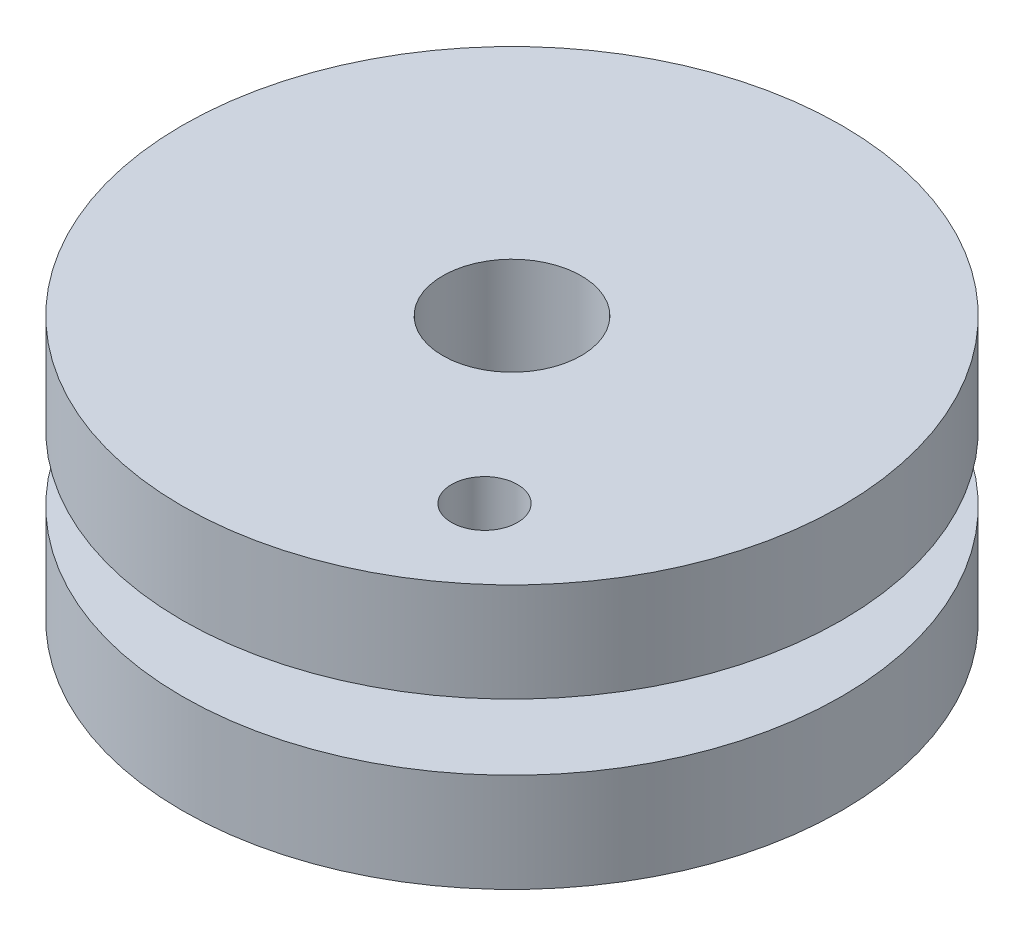
ISO-10303-21;
HEADER;
FILE_DESCRIPTION(('STEP AP214'),'2;1');
FILE_NAME('part.step','',(''),(''),'','','');
FILE_SCHEMA(('AUTOMOTIVE_DESIGN { 1 0 10303 214 1 1 1 1 }'));
ENDSEC;
DATA;
#1=APPLICATION_CONTEXT('core data for automotive mechanical design processes');
#2=APPLICATION_PROTOCOL_DEFINITION('international standard','automotive_design',2000,#1);
#3=PRODUCT_CONTEXT('',#1,'mechanical');
#4=PRODUCT('Part','Part','',(#3));
#5=PRODUCT_RELATED_PRODUCT_CATEGORY('part','',(#4));
#6=PRODUCT_DEFINITION_FORMATION('','',#4);
#7=PRODUCT_DEFINITION_CONTEXT('part definition',#1,'design');
#8=PRODUCT_DEFINITION('design','',#6,#7);
#9=PRODUCT_DEFINITION_SHAPE('','',#8);
#10=(LENGTH_UNIT() NAMED_UNIT(*) SI_UNIT(.MILLI.,.METRE.));
#11=(NAMED_UNIT(*) PLANE_ANGLE_UNIT() SI_UNIT($,.RADIAN.));
#12=(NAMED_UNIT(*) SI_UNIT($,.STERADIAN.) SOLID_ANGLE_UNIT());
#13=UNCERTAINTY_MEASURE_WITH_UNIT(LENGTH_MEASURE(1.E-05),#10,'distance_accuracy_value','');
#14=(GEOMETRIC_REPRESENTATION_CONTEXT(3) GLOBAL_UNCERTAINTY_ASSIGNED_CONTEXT((#13)) GLOBAL_UNIT_ASSIGNED_CONTEXT((#10,
#11,#12)) REPRESENTATION_CONTEXT('',''));
#15=CARTESIAN_POINT('',(0.,0.,0.));
#16=DIRECTION('',(0.,0.,1.));
#17=DIRECTION('',(1.,0.,0.));
#18=AXIS2_PLACEMENT_3D('',#15,#16,#17);
#19=CARTESIAN_POINT('',(0.,8.,0.));
#20=DIRECTION('',(0.,-1.,0.));
#21=DIRECTION('',(0.,0.,-1.));
#22=AXIS2_PLACEMENT_3D('',#19,#20,#21);
#23=CYLINDRICAL_SURFACE('',#22,10.);
#24=CARTESIAN_POINT('',(0.,8.,0.));
#25=DIRECTION('',(0.,1.,0.));
#26=DIRECTION('',(0.,0.,1.));
#27=AXIS2_PLACEMENT_3D('',#24,#25,#26);
#28=CIRCLE('',#27,10.);
#29=CARTESIAN_POINT('',(0.,8.,10.));
#30=VERTEX_POINT('',#29);
#31=EDGE_CURVE('E70',#30,#30,#28,.T.);
#32=ORIENTED_EDGE('',*,*,#31,.F.);
#33=EDGE_LOOP('',(#32));
#34=FACE_BOUND('',#33,.T.);
#35=CARTESIAN_POINT('',(0.,5.,0.));
#36=DIRECTION('',(0.,-1.,0.));
#37=DIRECTION('',(0.,0.,-1.));
#38=AXIS2_PLACEMENT_3D('',#35,#36,#37);
#39=CIRCLE('',#38,10.);
#40=CARTESIAN_POINT('',(0.,5.,-10.));
#41=VERTEX_POINT('',#40);
#42=EDGE_CURVE('E57',#41,#41,#39,.T.);
#43=ORIENTED_EDGE('',*,*,#42,.F.);
#44=EDGE_LOOP('',(#43));
#45=FACE_BOUND('',#44,.T.);
#46=ADVANCED_FACE('F35',(#34,#45),#23,.T.);
#47=CARTESIAN_POINT('',(0.,8.,0.));
#48=DIRECTION('',(0.,1.,0.));
#49=DIRECTION('',(0.,0.,1.));
#50=AXIS2_PLACEMENT_3D('',#47,#48,#49);
#51=PLANE('',#50);
#52=CARTESIAN_POINT('',(4.51518934785725,8.,5.34911816592198));
#53=DIRECTION('',(0.,1.,0.));
#54=DIRECTION('',(0.,0.,1.));
#55=AXIS2_PLACEMENT_3D('',#52,#53,#54);
#56=CIRCLE('',#55,1.);
#57=CARTESIAN_POINT('',(4.51518934785725,8.,6.34911816592198));
#58=VERTEX_POINT('',#57);
#59=EDGE_CURVE('E52',#58,#58,#56,.T.);
#60=ORIENTED_EDGE('',*,*,#59,.F.);
#61=EDGE_LOOP('',(#60));
#62=FACE_BOUND('',#61,.T.);
#63=ORIENTED_EDGE('',*,*,#31,.T.);
#64=EDGE_LOOP('',(#63));
#65=FACE_BOUND('',#64,.T.);
#66=CARTESIAN_POINT('',(0.,8.,0.));
#67=DIRECTION('',(0.,1.,0.));
#68=DIRECTION('',(0.,0.,1.));
#69=AXIS2_PLACEMENT_3D('',#66,#67,#68);
#70=CIRCLE('',#69,2.1);
#71=CARTESIAN_POINT('',(0.,8.,2.1));
#72=VERTEX_POINT('',#71);
#73=EDGE_CURVE('E64',#72,#72,#70,.T.);
#74=ORIENTED_EDGE('',*,*,#73,.F.);
#75=EDGE_LOOP('',(#74));
#76=FACE_BOUND('',#75,.T.);
#77=ADVANCED_FACE('F96',(#62,#65,#76),#51,.T.);
#78=CARTESIAN_POINT('',(0.,0.,0.));
#79=DIRECTION('',(0.,1.,0.));
#80=DIRECTION('',(0.,0.,1.));
#81=AXIS2_PLACEMENT_3D('',#78,#79,#80);
#82=PLANE('',#81);
#83=CARTESIAN_POINT('',(0.,0.,0.));
#84=DIRECTION('',(0.,1.,0.));
#85=DIRECTION('',(0.,0.,1.));
#86=AXIS2_PLACEMENT_3D('',#83,#84,#85);
#87=CIRCLE('',#86,10.);
#88=CARTESIAN_POINT('',(0.,0.,10.));
#89=VERTEX_POINT('',#88);
#90=EDGE_CURVE('E67',#89,#89,#87,.T.);
#91=ORIENTED_EDGE('',*,*,#90,.F.);
#92=EDGE_LOOP('',(#91));
#93=FACE_BOUND('',#92,.T.);
#94=CARTESIAN_POINT('',(0.,0.,0.));
#95=DIRECTION('',(0.,1.,0.));
#96=DIRECTION('',(0.,0.,1.));
#97=AXIS2_PLACEMENT_3D('',#94,#95,#96);
#98=CIRCLE('',#97,2.1);
#99=CARTESIAN_POINT('',(0.,0.,2.1));
#100=VERTEX_POINT('',#99);
#101=EDGE_CURVE('E60',#100,#100,#98,.T.);
#102=ORIENTED_EDGE('',*,*,#101,.T.);
#103=EDGE_LOOP('',(#102));
#104=FACE_BOUND('',#103,.T.);
#105=ADVANCED_FACE('F104',(#93,#104),#82,.F.);
#106=CARTESIAN_POINT('',(0.,3.,0.));
#107=DIRECTION('',(0.,-1.,0.));
#108=DIRECTION('',(0.,0.,-1.));
#109=AXIS2_PLACEMENT_3D('',#106,#107,#108);
#110=CIRCLE('',#109,10.);
#111=CARTESIAN_POINT('',(0.,3.,-10.));
#112=VERTEX_POINT('',#111);
#113=EDGE_CURVE('E61',#112,#112,#110,.T.);
#114=ORIENTED_EDGE('',*,*,#113,.T.);
#115=EDGE_LOOP('',(#114));
#116=FACE_BOUND('',#115,.T.);
#117=ORIENTED_EDGE('',*,*,#90,.T.);
#118=EDGE_LOOP('',(#117));
#119=FACE_BOUND('',#118,.T.);
#120=ADVANCED_FACE('F99',(#116,#119),#23,.T.);
#121=CARTESIAN_POINT('',(0.,8.,0.));
#122=DIRECTION('',(0.,-1.,0.));
#123=DIRECTION('',(0.,0.,-1.));
#124=AXIS2_PLACEMENT_3D('',#121,#122,#123);
#125=CYLINDRICAL_SURFACE('',#124,2.1);
#126=ORIENTED_EDGE('',*,*,#73,.T.);
#127=EDGE_LOOP('',(#126));
#128=FACE_BOUND('',#127,.T.);
#129=ORIENTED_EDGE('',*,*,#101,.F.);
#130=EDGE_LOOP('',(#129));
#131=FACE_BOUND('',#130,.T.);
#132=ADVANCED_FACE('F111',(#128,#131),#125,.F.);
#133=CARTESIAN_POINT('',(0.,5.,0.));
#134=DIRECTION('',(0.,-1.,0.));
#135=DIRECTION('',(0.,0.,-1.));
#136=AXIS2_PLACEMENT_3D('',#133,#134,#135);
#137=PLANE('',#136);
#138=CARTESIAN_POINT('',(0.,5.,0.));
#139=DIRECTION('',(0.,-1.,0.));
#140=DIRECTION('',(0.,0.,-1.));
#141=AXIS2_PLACEMENT_3D('',#138,#139,#140);
#142=CIRCLE('',#141,6.);
#143=CARTESIAN_POINT('',(3.87016229816335,5.,4.58495842793312));
#144=VERTEX_POINT('',#143);
#145=EDGE_CURVE('E43',#144,#144,#142,.F.);
#146=ORIENTED_EDGE('',*,*,#145,.T.);
#147=CARTESIAN_POINT('',(4.51518934785725,5.,5.34911816592198));
#148=DIRECTION('',(0.,-1.,0.));
#149=DIRECTION('',(0.,0.,-1.));
#150=AXIS2_PLACEMENT_3D('',#147,#148,#149);
#151=CIRCLE('',#150,1.);
#152=EDGE_CURVE('E47',#144,#144,#151,.F.);
#153=ORIENTED_EDGE('',*,*,#152,.T.);
#154=EDGE_LOOP('',(#146,#153));
#155=FACE_BOUND('',#154,.T.);
#156=ORIENTED_EDGE('',*,*,#42,.T.);
#157=EDGE_LOOP('',(#156));
#158=FACE_BOUND('',#157,.T.);
#159=ADVANCED_FACE('F76',(#155,#158),#137,.T.);
#160=CARTESIAN_POINT('',(0.,3.,0.));
#161=DIRECTION('',(0.,-1.,0.));
#162=DIRECTION('',(0.,0.,-1.));
#163=AXIS2_PLACEMENT_3D('',#160,#161,#162);
#164=PLANE('',#163);
#165=CARTESIAN_POINT('',(0.,3.,0.));
#166=DIRECTION('',(0.,-1.,0.));
#167=DIRECTION('',(0.,0.,-1.));
#168=AXIS2_PLACEMENT_3D('',#165,#166,#167);
#169=CIRCLE('',#168,6.);
#170=CARTESIAN_POINT('',(0.,3.,-6.));
#171=VERTEX_POINT('',#170);
#172=EDGE_CURVE('E11',#171,#171,#169,.T.);
#173=ORIENTED_EDGE('',*,*,#172,.T.);
#174=EDGE_LOOP('',(#173));
#175=FACE_BOUND('',#174,.T.);
#176=ORIENTED_EDGE('',*,*,#113,.F.);
#177=EDGE_LOOP('',(#176));
#178=FACE_BOUND('',#177,.T.);
#179=ADVANCED_FACE('F86',(#175,#178),#164,.F.);
#180=CARTESIAN_POINT('',(0.,4.,0.));
#181=DIRECTION('',(0.,-1.,0.));
#182=DIRECTION('',(0.,0.,-1.));
#183=AXIS2_PLACEMENT_3D('',#180,#181,#182);
#184=TOROIDAL_SURFACE('',#183,6.,1.);
#185=ORIENTED_EDGE('',*,*,#172,.F.);
#186=EDGE_LOOP('',(#185));
#187=FACE_BOUND('',#186,.T.);
#188=CARTESIAN_POINT('',(0.,4.,0.));
#189=DIRECTION('',(0.,-1.,0.));
#190=DIRECTION('',(0.,0.,-1.));
#191=AXIS2_PLACEMENT_3D('',#188,#189,#190);
#192=CIRCLE('',#191,5.);
#193=CARTESIAN_POINT('',(0.,4.,-5.));
#194=VERTEX_POINT('',#193);
#195=EDGE_CURVE('E39',#194,#194,#192,.F.);
#196=ORIENTED_EDGE('',*,*,#195,.F.);
#197=EDGE_LOOP('',(#196));
#198=FACE_BOUND('',#197,.T.);
#199=ADVANCED_FACE('F37',(#187,#198),#184,.F.);
#200=CARTESIAN_POINT('',(0.,4.,0.));
#201=DIRECTION('',(0.,-1.,0.));
#202=DIRECTION('',(0.,0.,-1.));
#203=AXIS2_PLACEMENT_3D('',#200,#201,#202);
#204=TOROIDAL_SURFACE('',#203,6.,1.);
#205=ORIENTED_EDGE('',*,*,#145,.F.);
#206=EDGE_LOOP('',(#205));
#207=FACE_BOUND('',#206,.T.);
#208=ORIENTED_EDGE('',*,*,#195,.T.);
#209=EDGE_LOOP('',(#208));
#210=FACE_BOUND('',#209,.T.);
#211=ADVANCED_FACE('F79',(#207,#210),#204,.F.);
#212=CARTESIAN_POINT('',(4.51518934785725,-0.000999999999999265,5.34911816592198));
#213=DIRECTION('',(0.,1.,0.));
#214=DIRECTION('',(0.,0.,1.));
#215=AXIS2_PLACEMENT_3D('',#212,#213,#214);
#216=CYLINDRICAL_SURFACE('',#215,1.);
#217=ORIENTED_EDGE('',*,*,#152,.F.);
#218=EDGE_LOOP('',(#217));
#219=FACE_BOUND('',#218,.T.);
#220=ORIENTED_EDGE('',*,*,#59,.T.);
#221=EDGE_LOOP('',(#220));
#222=FACE_BOUND('',#221,.T.);
#223=ADVANCED_FACE('F48',(#219,#222),#216,.F.);
#224=CLOSED_SHELL('',(#46,#77,#105,#120,#132,#159,#179,#199,#211,#223));
#225=MANIFOLD_SOLID_BREP('B2',#224);
#226=ADVANCED_BREP_SHAPE_REPRESENTATION('',(#18,#225),#14);
#227=SHAPE_DEFINITION_REPRESENTATION(#9,#226);
ENDSEC;
END-ISO-10303-21;
